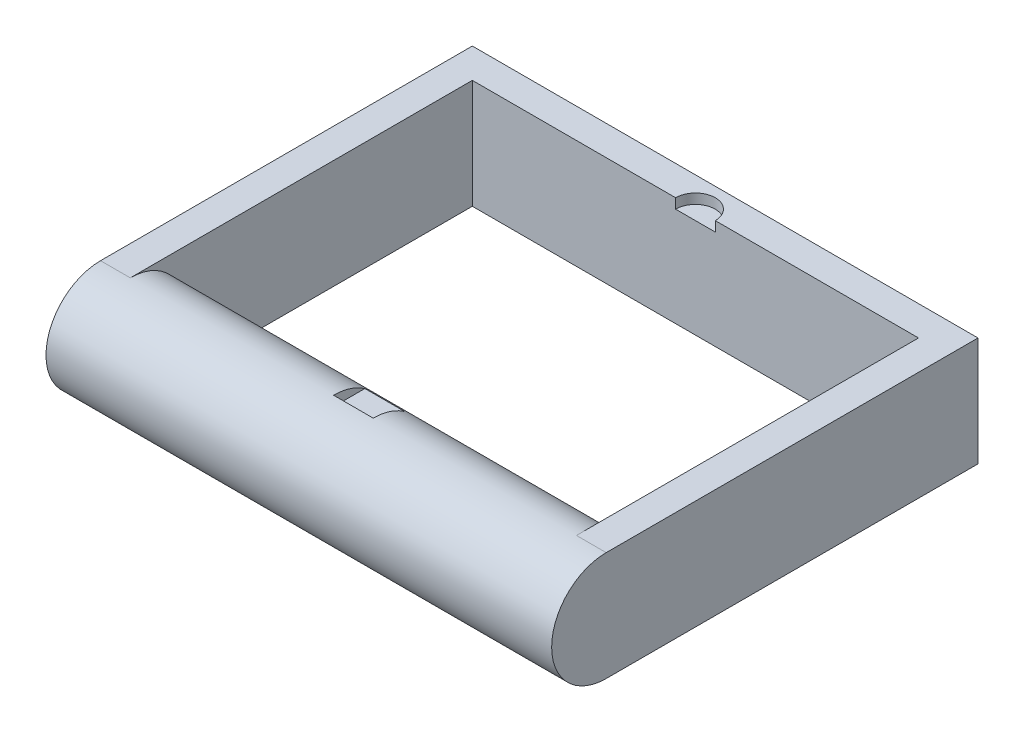
ISO-10303-21;
HEADER;
FILE_DESCRIPTION(('STEP AP214'),'2;1');
FILE_NAME('part.step','',(''),(''),'','','');
FILE_SCHEMA(('AUTOMOTIVE_DESIGN { 1 0 10303 214 1 1 1 1 }'));
ENDSEC;
DATA;
#1=APPLICATION_CONTEXT('core data for automotive mechanical design processes');
#2=APPLICATION_PROTOCOL_DEFINITION('international standard','automotive_design',2000,#1);
#3=PRODUCT_CONTEXT('',#1,'mechanical');
#4=PRODUCT('Part','Part','',(#3));
#5=PRODUCT_RELATED_PRODUCT_CATEGORY('part','',(#4));
#6=PRODUCT_DEFINITION_FORMATION('','',#4);
#7=PRODUCT_DEFINITION_CONTEXT('part definition',#1,'design');
#8=PRODUCT_DEFINITION('design','',#6,#7);
#9=PRODUCT_DEFINITION_SHAPE('','',#8);
#10=(LENGTH_UNIT() NAMED_UNIT(*) SI_UNIT(.MILLI.,.METRE.));
#11=(NAMED_UNIT(*) PLANE_ANGLE_UNIT() SI_UNIT($,.RADIAN.));
#12=(NAMED_UNIT(*) SI_UNIT($,.STERADIAN.) SOLID_ANGLE_UNIT());
#13=UNCERTAINTY_MEASURE_WITH_UNIT(LENGTH_MEASURE(1.E-05),#10,'distance_accuracy_value','');
#14=(GEOMETRIC_REPRESENTATION_CONTEXT(3) GLOBAL_UNCERTAINTY_ASSIGNED_CONTEXT((#13)) GLOBAL_UNIT_ASSIGNED_CONTEXT((#10,
#11,#12)) REPRESENTATION_CONTEXT('',''));
#15=CARTESIAN_POINT('',(0.,0.,0.));
#16=DIRECTION('',(0.,0.,1.));
#17=DIRECTION('',(1.,0.,0.));
#18=AXIS2_PLACEMENT_3D('',#15,#16,#17);
#19=CARTESIAN_POINT('',(22.5,0.,0.));
#20=DIRECTION('',(-1.,0.,0.));
#21=DIRECTION('',(0.,0.,1.));
#22=AXIS2_PLACEMENT_3D('',#19,#20,#21);
#23=CYLINDRICAL_SURFACE('',#22,2.75);
#24=DIRECTION('',(-1.,0.,0.));
#25=VECTOR('',#24,1.);
#26=CARTESIAN_POINT('',(22.5,2.25,-1.58113883008419));
#27=LINE('',#26,#25);
#28=CARTESIAN_POINT('',(10.25,2.25,-1.58113883008418));
#29=VERTEX_POINT('',#28);
#30=CARTESIAN_POINT('',(12.25,2.25,-1.58113883008418));
#31=VERTEX_POINT('',#30);
#32=EDGE_CURVE('E139',#29,#31,#27,.F.);
#33=ORIENTED_EDGE('',*,*,#32,.T.);
#34=CARTESIAN_POINT('',(12.25,0.,0.));
#35=DIRECTION('',(1.,0.,0.));
#36=DIRECTION('',(0.,0.,-1.));
#37=AXIS2_PLACEMENT_3D('',#34,#35,#36);
#38=CIRCLE('',#37,2.75);
#39=CARTESIAN_POINT('',(12.25,2.75,0.));
#40=VERTEX_POINT('',#39);
#41=EDGE_CURVE('E166',#31,#40,#38,.T.);
#42=ORIENTED_EDGE('',*,*,#41,.T.);
#43=DIRECTION('',(1.,0.,0.));
#44=VECTOR('',#43,1.);
#45=CARTESIAN_POINT('',(10.25,2.75,0.));
#46=LINE('',#45,#44);
#47=CARTESIAN_POINT('',(10.25,2.75,0.));
#48=VERTEX_POINT('',#47);
#49=EDGE_CURVE('E157',#48,#40,#46,.T.);
#50=ORIENTED_EDGE('',*,*,#49,.F.);
#51=CARTESIAN_POINT('',(10.25,0.,0.));
#52=DIRECTION('',(-1.,0.,0.));
#53=DIRECTION('',(0.,0.,1.));
#54=AXIS2_PLACEMENT_3D('',#51,#52,#53);
#55=CIRCLE('',#54,2.75);
#56=EDGE_CURVE('E144',#48,#29,#55,.T.);
#57=ORIENTED_EDGE('',*,*,#56,.T.);
#58=EDGE_LOOP('',(#33,#42,#50,#57));
#59=FACE_BOUND('',#58,.T.);
#60=CARTESIAN_POINT('',(22.5,0.,0.));
#61=DIRECTION('',(1.,0.,0.));
#62=DIRECTION('',(0.,0.,-1.));
#63=AXIS2_PLACEMENT_3D('',#60,#61,#62);
#64=CIRCLE('',#63,2.75);
#65=CARTESIAN_POINT('',(22.5,-2.75,0.));
#66=VERTEX_POINT('',#65);
#67=CARTESIAN_POINT('',(22.5,2.75,0.));
#68=VERTEX_POINT('',#67);
#69=EDGE_CURVE('E45',#66,#68,#64,.T.);
#70=ORIENTED_EDGE('',*,*,#69,.F.);
#71=DIRECTION('',(-1.,0.,0.));
#72=VECTOR('',#71,1.);
#73=CARTESIAN_POINT('',(24.,-2.75,0.));
#74=LINE('',#73,#72);
#75=CARTESIAN_POINT('',(24.,-2.75,0.));
#76=VERTEX_POINT('',#75);
#77=EDGE_CURVE('E196',#76,#66,#74,.T.);
#78=ORIENTED_EDGE('',*,*,#77,.F.);
#79=CARTESIAN_POINT('',(24.,0.,0.));
#80=DIRECTION('',(1.,0.,0.));
#81=DIRECTION('',(0.,0.,-1.));
#82=AXIS2_PLACEMENT_3D('',#79,#80,#81);
#83=CIRCLE('',#82,2.75);
#84=CARTESIAN_POINT('',(24.,2.75,0.));
#85=VERTEX_POINT('',#84);
#86=EDGE_CURVE('E191',#85,#76,#83,.T.);
#87=ORIENTED_EDGE('',*,*,#86,.F.);
#88=DIRECTION('',(-1.,0.,0.));
#89=VECTOR('',#88,1.);
#90=CARTESIAN_POINT('',(24.,2.75,0.));
#91=LINE('',#90,#89);
#92=EDGE_CURVE('E205',#85,#68,#91,.T.);
#93=ORIENTED_EDGE('',*,*,#92,.T.);
#94=EDGE_LOOP('',(#70,#78,#87,#93));
#95=FACE_BOUND('',#94,.T.);
#96=CARTESIAN_POINT('',(0.,0.,0.));
#97=DIRECTION('',(1.,0.,0.));
#98=DIRECTION('',(0.,0.,-1.));
#99=AXIS2_PLACEMENT_3D('',#96,#97,#98);
#100=CIRCLE('',#99,2.75);
#101=CARTESIAN_POINT('',(0.,-2.75,0.));
#102=VERTEX_POINT('',#101);
#103=CARTESIAN_POINT('',(0.,2.75,0.));
#104=VERTEX_POINT('',#103);
#105=EDGE_CURVE('E228',#102,#104,#100,.T.);
#106=ORIENTED_EDGE('',*,*,#105,.T.);
#107=DIRECTION('',(1.,0.,0.));
#108=VECTOR('',#107,1.);
#109=CARTESIAN_POINT('',(-1.5,2.75,0.));
#110=LINE('',#109,#108);
#111=CARTESIAN_POINT('',(-1.5,2.75,0.));
#112=VERTEX_POINT('',#111);
#113=EDGE_CURVE('E226',#112,#104,#110,.T.);
#114=ORIENTED_EDGE('',*,*,#113,.F.);
#115=CARTESIAN_POINT('',(-1.5,0.,0.));
#116=DIRECTION('',(-1.,0.,0.));
#117=DIRECTION('',(0.,0.,1.));
#118=AXIS2_PLACEMENT_3D('',#115,#116,#117);
#119=CIRCLE('',#118,2.75);
#120=CARTESIAN_POINT('',(-1.5,-2.75,0.));
#121=VERTEX_POINT('',#120);
#122=EDGE_CURVE('E209',#121,#112,#119,.T.);
#123=ORIENTED_EDGE('',*,*,#122,.F.);
#124=DIRECTION('',(1.,0.,0.));
#125=VECTOR('',#124,1.);
#126=CARTESIAN_POINT('',(-1.5,-2.75,0.));
#127=LINE('',#126,#125);
#128=EDGE_CURVE('E217',#121,#102,#127,.T.);
#129=ORIENTED_EDGE('',*,*,#128,.T.);
#130=EDGE_LOOP('',(#106,#114,#123,#129));
#131=FACE_BOUND('',#130,.T.);
#132=ADVANCED_FACE('F38',(#59,#95,#131),#23,.T.);
#133=CARTESIAN_POINT('',(-1.5,2.75,0.));
#134=DIRECTION('',(0.,-1.,0.));
#135=DIRECTION('',(0.,0.,-1.));
#136=AXIS2_PLACEMENT_3D('',#133,#134,#135);
#137=PLANE('',#136);
#138=DIRECTION('',(1.,0.,0.));
#139=VECTOR('',#138,1.);
#140=CARTESIAN_POINT('',(24.,2.75,-17.25));
#141=LINE('',#140,#139);
#142=CARTESIAN_POINT('',(0.,2.75,-17.25));
#143=VERTEX_POINT('',#142);
#144=CARTESIAN_POINT('',(10.25,2.75,-17.25));
#145=VERTEX_POINT('',#144);
#146=EDGE_CURVE('E174',#143,#145,#141,.T.);
#147=ORIENTED_EDGE('',*,*,#146,.T.);
#148=CARTESIAN_POINT('',(11.25,2.75,-17.25));
#149=DIRECTION('',(0.,1.,0.));
#150=DIRECTION('',(0.,0.,-1.));
#151=AXIS2_PLACEMENT_3D('',#148,#149,#150);
#152=CIRCLE('',#151,1.);
#153=CARTESIAN_POINT('',(12.25,2.75,-17.25));
#154=VERTEX_POINT('',#153);
#155=EDGE_CURVE('E155',#154,#145,#152,.T.);
#156=ORIENTED_EDGE('',*,*,#155,.F.);
#157=CARTESIAN_POINT('',(22.5,2.75,-17.25));
#158=VERTEX_POINT('',#157);
#159=EDGE_CURVE('E186',#154,#158,#141,.T.);
#160=ORIENTED_EDGE('',*,*,#159,.T.);
#161=DIRECTION('',(0.,0.,1.));
#162=VECTOR('',#161,1.);
#163=CARTESIAN_POINT('',(22.5,2.75,0.));
#164=LINE('',#163,#162);
#165=EDGE_CURVE('E199',#158,#68,#164,.T.);
#166=ORIENTED_EDGE('',*,*,#165,.T.);
#167=ORIENTED_EDGE('',*,*,#92,.F.);
#168=DIRECTION('',(0.,0.,1.));
#169=VECTOR('',#168,1.);
#170=CARTESIAN_POINT('',(24.,2.75,0.));
#171=LINE('',#170,#169);
#172=CARTESIAN_POINT('',(24.,2.75,-18.75));
#173=VERTEX_POINT('',#172);
#174=EDGE_CURVE('E189',#173,#85,#171,.T.);
#175=ORIENTED_EDGE('',*,*,#174,.F.);
#176=DIRECTION('',(1.,0.,0.));
#177=VECTOR('',#176,1.);
#178=CARTESIAN_POINT('',(24.,2.75,-18.75));
#179=LINE('',#178,#177);
#180=CARTESIAN_POINT('',(-1.5,2.75,-18.75));
#181=VERTEX_POINT('',#180);
#182=EDGE_CURVE('E180',#181,#173,#179,.T.);
#183=ORIENTED_EDGE('',*,*,#182,.F.);
#184=DIRECTION('',(0.,0.,-1.));
#185=VECTOR('',#184,1.);
#186=CARTESIAN_POINT('',(-1.5,2.75,0.));
#187=LINE('',#186,#185);
#188=EDGE_CURVE('E212',#112,#181,#187,.T.);
#189=ORIENTED_EDGE('',*,*,#188,.F.);
#190=ORIENTED_EDGE('',*,*,#113,.T.);
#191=DIRECTION('',(0.,0.,-1.));
#192=VECTOR('',#191,1.);
#193=CARTESIAN_POINT('',(0.,2.75,0.));
#194=LINE('',#193,#192);
#195=EDGE_CURVE('E208',#104,#143,#194,.T.);
#196=ORIENTED_EDGE('',*,*,#195,.T.);
#197=EDGE_LOOP('',(#147,#156,#160,#166,#167,#175,#183,#189,#190,#196));
#198=FACE_BOUND('',#197,.T.);
#199=ADVANCED_FACE('F251',(#198),#137,.F.);
#200=CARTESIAN_POINT('',(-1.5,-2.75,0.));
#201=DIRECTION('',(0.,1.,0.));
#202=DIRECTION('',(0.,0.,1.));
#203=AXIS2_PLACEMENT_3D('',#200,#201,#202);
#204=PLANE('',#203);
#205=DIRECTION('',(0.,0.,1.));
#206=VECTOR('',#205,1.);
#207=CARTESIAN_POINT('',(0.,-2.75,0.));
#208=LINE('',#207,#206);
#209=CARTESIAN_POINT('',(0.,-2.75,-17.25));
#210=VERTEX_POINT('',#209);
#211=EDGE_CURVE('E213',#210,#102,#208,.T.);
#212=ORIENTED_EDGE('',*,*,#211,.T.);
#213=ORIENTED_EDGE('',*,*,#128,.F.);
#214=DIRECTION('',(0.,0.,1.));
#215=VECTOR('',#214,1.);
#216=CARTESIAN_POINT('',(-1.5,-2.75,0.));
#217=LINE('',#216,#215);
#218=CARTESIAN_POINT('',(-1.5,-2.75,-18.75));
#219=VERTEX_POINT('',#218);
#220=EDGE_CURVE('E215',#219,#121,#217,.T.);
#221=ORIENTED_EDGE('',*,*,#220,.F.);
#222=DIRECTION('',(-1.,0.,0.));
#223=VECTOR('',#222,1.);
#224=CARTESIAN_POINT('',(24.,-2.75,-18.75));
#225=LINE('',#224,#223);
#226=CARTESIAN_POINT('',(24.,-2.75,-18.75));
#227=VERTEX_POINT('',#226);
#228=EDGE_CURVE('E173',#227,#219,#225,.T.);
#229=ORIENTED_EDGE('',*,*,#228,.F.);
#230=DIRECTION('',(0.,0.,-1.));
#231=VECTOR('',#230,1.);
#232=CARTESIAN_POINT('',(24.,-2.75,0.));
#233=LINE('',#232,#231);
#234=EDGE_CURVE('E194',#76,#227,#233,.T.);
#235=ORIENTED_EDGE('',*,*,#234,.F.);
#236=ORIENTED_EDGE('',*,*,#77,.T.);
#237=DIRECTION('',(0.,0.,-1.));
#238=VECTOR('',#237,1.);
#239=CARTESIAN_POINT('',(22.5,-2.75,0.));
#240=LINE('',#239,#238);
#241=CARTESIAN_POINT('',(22.5,-2.75,-17.25));
#242=VERTEX_POINT('',#241);
#243=EDGE_CURVE('E192',#66,#242,#240,.T.);
#244=ORIENTED_EDGE('',*,*,#243,.T.);
#245=DIRECTION('',(-1.,0.,0.));
#246=VECTOR('',#245,1.);
#247=CARTESIAN_POINT('',(24.,-2.75,-17.25));
#248=LINE('',#247,#246);
#249=EDGE_CURVE('E169',#242,#210,#248,.T.);
#250=ORIENTED_EDGE('',*,*,#249,.T.);
#251=EDGE_LOOP('',(#212,#213,#221,#229,#235,#236,#244,#250));
#252=FACE_BOUND('',#251,.T.);
#253=ADVANCED_FACE('F239',(#252),#204,.F.);
#254=CARTESIAN_POINT('',(-1.5,0.,0.));
#255=DIRECTION('',(-1.,0.,0.));
#256=DIRECTION('',(0.,0.,1.));
#257=AXIS2_PLACEMENT_3D('',#254,#255,#256);
#258=PLANE('',#257);
#259=ORIENTED_EDGE('',*,*,#122,.T.);
#260=ORIENTED_EDGE('',*,*,#188,.T.);
#261=DIRECTION('',(0.,1.,0.));
#262=VECTOR('',#261,1.);
#263=CARTESIAN_POINT('',(-1.5,-2.75,-18.75));
#264=LINE('',#263,#262);
#265=EDGE_CURVE('E177',#219,#181,#264,.T.);
#266=ORIENTED_EDGE('',*,*,#265,.F.);
#267=ORIENTED_EDGE('',*,*,#220,.T.);
#268=EDGE_LOOP('',(#259,#260,#266,#267));
#269=FACE_BOUND('',#268,.T.);
#270=ADVANCED_FACE('F255',(#269),#258,.T.);
#271=CARTESIAN_POINT('',(0.,0.,0.));
#272=DIRECTION('',(-1.,0.,0.));
#273=DIRECTION('',(0.,0.,1.));
#274=AXIS2_PLACEMENT_3D('',#271,#272,#273);
#275=PLANE('',#274);
#276=ORIENTED_EDGE('',*,*,#105,.F.);
#277=ORIENTED_EDGE('',*,*,#211,.F.);
#278=DIRECTION('',(0.,-1.,0.));
#279=VECTOR('',#278,1.);
#280=CARTESIAN_POINT('',(0.,2.75,-17.25));
#281=LINE('',#280,#279);
#282=EDGE_CURVE('E219',#143,#210,#281,.T.);
#283=ORIENTED_EDGE('',*,*,#282,.F.);
#284=ORIENTED_EDGE('',*,*,#195,.F.);
#285=EDGE_LOOP('',(#276,#277,#283,#284));
#286=FACE_BOUND('',#285,.T.);
#287=ADVANCED_FACE('F236',(#286),#275,.F.);
#288=CARTESIAN_POINT('',(22.5,0.,0.));
#289=DIRECTION('',(1.,0.,0.));
#290=DIRECTION('',(0.,0.,-1.));
#291=AXIS2_PLACEMENT_3D('',#288,#289,#290);
#292=PLANE('',#291);
#293=ORIENTED_EDGE('',*,*,#243,.F.);
#294=ORIENTED_EDGE('',*,*,#69,.T.);
#295=ORIENTED_EDGE('',*,*,#165,.F.);
#296=DIRECTION('',(0.,1.,0.));
#297=VECTOR('',#296,1.);
#298=CARTESIAN_POINT('',(22.5,-2.75,-17.25));
#299=LINE('',#298,#297);
#300=EDGE_CURVE('E183',#242,#158,#299,.T.);
#301=ORIENTED_EDGE('',*,*,#300,.F.);
#302=EDGE_LOOP('',(#293,#294,#295,#301));
#303=FACE_BOUND('',#302,.T.);
#304=ADVANCED_FACE('F268',(#303),#292,.F.);
#305=CARTESIAN_POINT('',(24.,0.,0.));
#306=DIRECTION('',(1.,0.,0.));
#307=DIRECTION('',(0.,0.,-1.));
#308=AXIS2_PLACEMENT_3D('',#305,#306,#307);
#309=PLANE('',#308);
#310=ORIENTED_EDGE('',*,*,#234,.T.);
#311=DIRECTION('',(0.,-1.,0.));
#312=VECTOR('',#311,1.);
#313=CARTESIAN_POINT('',(24.,-2.75,-18.75));
#314=LINE('',#313,#312);
#315=EDGE_CURVE('E170',#173,#227,#314,.T.);
#316=ORIENTED_EDGE('',*,*,#315,.F.);
#317=ORIENTED_EDGE('',*,*,#174,.T.);
#318=ORIENTED_EDGE('',*,*,#86,.T.);
#319=EDGE_LOOP('',(#310,#316,#317,#318));
#320=FACE_BOUND('',#319,.T.);
#321=ADVANCED_FACE('F262',(#320),#309,.T.);
#322=CARTESIAN_POINT('',(0.,0.,-18.75));
#323=DIRECTION('',(0.,0.,1.));
#324=DIRECTION('',(1.,0.,0.));
#325=AXIS2_PLACEMENT_3D('',#322,#323,#324);
#326=PLANE('',#325);
#327=ORIENTED_EDGE('',*,*,#315,.T.);
#328=ORIENTED_EDGE('',*,*,#228,.T.);
#329=ORIENTED_EDGE('',*,*,#265,.T.);
#330=ORIENTED_EDGE('',*,*,#182,.T.);
#331=EDGE_LOOP('',(#327,#328,#329,#330));
#332=FACE_BOUND('',#331,.T.);
#333=ADVANCED_FACE('F259',(#332),#326,.F.);
#334=CARTESIAN_POINT('',(0.,0.,-17.25));
#335=DIRECTION('',(0.,0.,1.));
#336=DIRECTION('',(1.,0.,0.));
#337=AXIS2_PLACEMENT_3D('',#334,#335,#336);
#338=PLANE('',#337);
#339=DIRECTION('',(0.,1.,0.));
#340=VECTOR('',#339,1.);
#341=CARTESIAN_POINT('',(12.25,2.25,-17.25));
#342=LINE('',#341,#340);
#343=CARTESIAN_POINT('',(12.25,2.25,-17.25));
#344=VERTEX_POINT('',#343);
#345=EDGE_CURVE('E159',#344,#154,#342,.T.);
#346=ORIENTED_EDGE('',*,*,#345,.F.);
#347=DIRECTION('',(1.,0.,0.));
#348=VECTOR('',#347,1.);
#349=CARTESIAN_POINT('',(0.,2.25,-17.25));
#350=LINE('',#349,#348);
#351=CARTESIAN_POINT('',(10.25,2.25,-17.25));
#352=VERTEX_POINT('',#351);
#353=EDGE_CURVE('E11',#352,#344,#350,.T.);
#354=ORIENTED_EDGE('',*,*,#353,.F.);
#355=DIRECTION('',(0.,1.,0.));
#356=VECTOR('',#355,1.);
#357=CARTESIAN_POINT('',(10.25,2.25,-17.25));
#358=LINE('',#357,#356);
#359=EDGE_CURVE('E147',#352,#145,#358,.T.);
#360=ORIENTED_EDGE('',*,*,#359,.T.);
#361=ORIENTED_EDGE('',*,*,#146,.F.);
#362=ORIENTED_EDGE('',*,*,#282,.T.);
#363=ORIENTED_EDGE('',*,*,#249,.F.);
#364=ORIENTED_EDGE('',*,*,#300,.T.);
#365=ORIENTED_EDGE('',*,*,#159,.F.);
#366=EDGE_LOOP('',(#346,#354,#360,#361,#362,#363,#364,#365));
#367=FACE_BOUND('',#366,.T.);
#368=ADVANCED_FACE('F245',(#367),#338,.T.);
#369=CARTESIAN_POINT('',(11.25,2.25,-17.25));
#370=DIRECTION('',(0.,-1.,0.));
#371=DIRECTION('',(0.,0.,-1.));
#372=AXIS2_PLACEMENT_3D('',#369,#370,#371);
#373=PLANE('',#372);
#374=ORIENTED_EDGE('',*,*,#353,.T.);
#375=CARTESIAN_POINT('',(11.25,2.25,-17.25));
#376=DIRECTION('',(0.,1.,0.));
#377=DIRECTION('',(0.,0.,-1.));
#378=AXIS2_PLACEMENT_3D('',#375,#376,#377);
#379=CIRCLE('',#378,1.);
#380=EDGE_CURVE('E58',#344,#352,#379,.T.);
#381=ORIENTED_EDGE('',*,*,#380,.T.);
#382=EDGE_LOOP('',(#374,#381));
#383=FACE_BOUND('',#382,.T.);
#384=ADVANCED_FACE('F285',(#383),#373,.F.);
#385=CARTESIAN_POINT('',(11.25,2.25,-17.25));
#386=DIRECTION('',(0.,1.,0.));
#387=DIRECTION('',(0.,0.,1.));
#388=AXIS2_PLACEMENT_3D('',#385,#386,#387);
#389=CYLINDRICAL_SURFACE('',#388,1.);
#390=ORIENTED_EDGE('',*,*,#155,.T.);
#391=ORIENTED_EDGE('',*,*,#359,.F.);
#392=ORIENTED_EDGE('',*,*,#380,.F.);
#393=ORIENTED_EDGE('',*,*,#345,.T.);
#394=EDGE_LOOP('',(#390,#391,#392,#393));
#395=FACE_BOUND('',#394,.T.);
#396=ADVANCED_FACE('F278',(#395),#389,.F.);
#397=CARTESIAN_POINT('',(12.25,2.25,-17.25));
#398=DIRECTION('',(1.,0.,0.));
#399=DIRECTION('',(0.,0.,-1.));
#400=AXIS2_PLACEMENT_3D('',#397,#398,#399);
#401=PLANE('',#400);
#402=DIRECTION('',(0.,0.,-1.));
#403=VECTOR('',#402,1.);
#404=CARTESIAN_POINT('',(12.25,2.25,-17.25));
#405=LINE('',#404,#403);
#406=CARTESIAN_POINT('',(12.25,2.25,0.));
#407=VERTEX_POINT('',#406);
#408=EDGE_CURVE('E150',#407,#31,#405,.T.);
#409=ORIENTED_EDGE('',*,*,#408,.F.);
#410=DIRECTION('',(0.,1.,0.));
#411=VECTOR('',#410,1.);
#412=CARTESIAN_POINT('',(12.25,2.25,0.));
#413=LINE('',#412,#411);
#414=EDGE_CURVE('E146',#407,#40,#413,.T.);
#415=ORIENTED_EDGE('',*,*,#414,.T.);
#416=ORIENTED_EDGE('',*,*,#41,.F.);
#417=EDGE_LOOP('',(#409,#415,#416));
#418=FACE_BOUND('',#417,.T.);
#419=ADVANCED_FACE('F276',(#418),#401,.F.);
#420=CARTESIAN_POINT('',(10.25,2.25,-17.25));
#421=DIRECTION('',(-1.,0.,0.));
#422=DIRECTION('',(0.,0.,1.));
#423=AXIS2_PLACEMENT_3D('',#420,#421,#422);
#424=PLANE('',#423);
#425=DIRECTION('',(0.,1.,0.));
#426=VECTOR('',#425,1.);
#427=CARTESIAN_POINT('',(10.25,2.25,0.));
#428=LINE('',#427,#426);
#429=CARTESIAN_POINT('',(10.25,2.25,0.));
#430=VERTEX_POINT('',#429);
#431=EDGE_CURVE('E52',#430,#48,#428,.T.);
#432=ORIENTED_EDGE('',*,*,#431,.F.);
#433=DIRECTION('',(0.,0.,1.));
#434=VECTOR('',#433,1.);
#435=CARTESIAN_POINT('',(10.25,2.25,-17.25));
#436=LINE('',#435,#434);
#437=EDGE_CURVE('E133',#29,#430,#436,.T.);
#438=ORIENTED_EDGE('',*,*,#437,.F.);
#439=ORIENTED_EDGE('',*,*,#56,.F.);
#440=EDGE_LOOP('',(#432,#438,#439));
#441=FACE_BOUND('',#440,.T.);
#442=ADVANCED_FACE('F143',(#441),#424,.F.);
#443=ORIENTED_EDGE('',*,*,#437,.T.);
#444=DIRECTION('',(1.,0.,0.));
#445=VECTOR('',#444,1.);
#446=CARTESIAN_POINT('',(10.25,2.25,0.));
#447=LINE('',#446,#445);
#448=EDGE_CURVE('E136',#430,#407,#447,.T.);
#449=ORIENTED_EDGE('',*,*,#448,.T.);
#450=ORIENTED_EDGE('',*,*,#408,.T.);
#451=ORIENTED_EDGE('',*,*,#32,.F.);
#452=EDGE_LOOP('',(#443,#449,#450,#451));
#453=FACE_BOUND('',#452,.T.);
#454=ADVANCED_FACE('F134',(#453),#373,.F.);
#455=CARTESIAN_POINT('',(10.25,2.25,0.));
#456=DIRECTION('',(0.,0.,1.));
#457=DIRECTION('',(1.,0.,0.));
#458=AXIS2_PLACEMENT_3D('',#455,#456,#457);
#459=PLANE('',#458);
#460=ORIENTED_EDGE('',*,*,#49,.T.);
#461=ORIENTED_EDGE('',*,*,#414,.F.);
#462=ORIENTED_EDGE('',*,*,#448,.F.);
#463=ORIENTED_EDGE('',*,*,#431,.T.);
#464=EDGE_LOOP('',(#460,#461,#462,#463));
#465=FACE_BOUND('',#464,.T.);
#466=ADVANCED_FACE('F149',(#465),#459,.F.);
#467=CLOSED_SHELL('',(#132,#199,#253,#270,#287,#304,#321,#333,#368,#384,#396,#419,#442,#454,#466));
#468=MANIFOLD_SOLID_BREP('B2',#467);
#469=ADVANCED_BREP_SHAPE_REPRESENTATION('',(#18,#468),#14);
#470=SHAPE_DEFINITION_REPRESENTATION(#9,#469);
ENDSEC;
END-ISO-10303-21;
